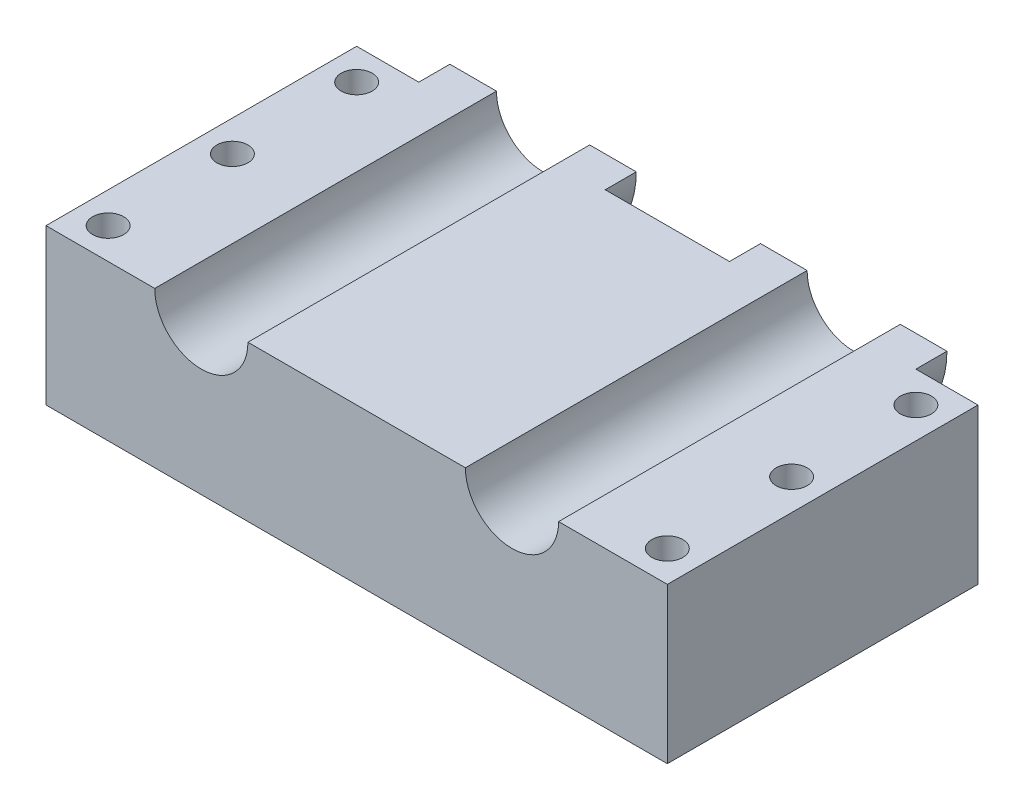
ISO-10303-21;
HEADER;
FILE_DESCRIPTION(('STEP AP214'),'2;1');
FILE_NAME('part.step','',(''),(''),'','','');
FILE_SCHEMA(('AUTOMOTIVE_DESIGN { 1 0 10303 214 1 1 1 1 }'));
ENDSEC;
DATA;
#1=APPLICATION_CONTEXT('core data for automotive mechanical design processes');
#2=APPLICATION_PROTOCOL_DEFINITION('international standard','automotive_design',2000,#1);
#3=PRODUCT_CONTEXT('',#1,'mechanical');
#4=PRODUCT('Part','Part','',(#3));
#5=PRODUCT_RELATED_PRODUCT_CATEGORY('part','',(#4));
#6=PRODUCT_DEFINITION_FORMATION('','',#4);
#7=PRODUCT_DEFINITION_CONTEXT('part definition',#1,'design');
#8=PRODUCT_DEFINITION('design','',#6,#7);
#9=PRODUCT_DEFINITION_SHAPE('','',#8);
#10=(LENGTH_UNIT() NAMED_UNIT(*) SI_UNIT(.MILLI.,.METRE.));
#11=(NAMED_UNIT(*) PLANE_ANGLE_UNIT() SI_UNIT($,.RADIAN.));
#12=(NAMED_UNIT(*) SI_UNIT($,.STERADIAN.) SOLID_ANGLE_UNIT());
#13=UNCERTAINTY_MEASURE_WITH_UNIT(LENGTH_MEASURE(1.E-05),#10,'distance_accuracy_value','');
#14=(GEOMETRIC_REPRESENTATION_CONTEXT(3) GLOBAL_UNCERTAINTY_ASSIGNED_CONTEXT((#13)) GLOBAL_UNIT_ASSIGNED_CONTEXT((#10,
#11,#12)) REPRESENTATION_CONTEXT('',''));
#15=CARTESIAN_POINT('',(0.,0.,0.));
#16=DIRECTION('',(0.,0.,1.));
#17=DIRECTION('',(1.,0.,0.));
#18=AXIS2_PLACEMENT_3D('',#15,#16,#17);
#19=CARTESIAN_POINT('',(0.,63.5,0.));
#20=DIRECTION('',(0.,-1.,0.));
#21=DIRECTION('',(0.,0.,-1.));
#22=AXIS2_PLACEMENT_3D('',#19,#20,#21);
#23=PLANE('',#22);
#24=CARTESIAN_POINT('',(12.6999999999995,63.5,63.5));
#25=DIRECTION('',(0.,1.,0.));
#26=DIRECTION('',(0.,0.,1.));
#27=AXIS2_PLACEMENT_3D('',#24,#25,#26);
#28=CIRCLE('',#27,6.35);
#29=CARTESIAN_POINT('',(12.6999999999995,63.5,69.85));
#30=VERTEX_POINT('',#29);
#31=EDGE_CURVE('E247',#30,#30,#28,.T.);
#32=ORIENTED_EDGE('',*,*,#31,.F.);
#33=EDGE_LOOP('',(#32));
#34=FACE_BOUND('',#33,.T.);
#35=CARTESIAN_POINT('',(12.699999999999,63.5,12.7));
#36=DIRECTION('',(0.,1.,0.));
#37=DIRECTION('',(0.,0.,1.));
#38=AXIS2_PLACEMENT_3D('',#35,#36,#37);
#39=CIRCLE('',#38,6.35);
#40=CARTESIAN_POINT('',(12.699999999999,63.5,19.05));
#41=VERTEX_POINT('',#40);
#42=EDGE_CURVE('E289',#41,#41,#39,.T.);
#43=ORIENTED_EDGE('',*,*,#42,.F.);
#44=EDGE_LOOP('',(#43));
#45=FACE_BOUND('',#44,.T.);
#46=CARTESIAN_POINT('',(12.7000000000001,63.5,114.3));
#47=DIRECTION('',(0.,1.,0.));
#48=DIRECTION('',(0.,0.,1.));
#49=AXIS2_PLACEMENT_3D('',#46,#47,#48);
#50=CIRCLE('',#49,6.35000000000001);
#51=CARTESIAN_POINT('',(12.7000000000001,63.5,120.65));
#52=VERTEX_POINT('',#51);
#53=EDGE_CURVE('E313',#52,#52,#50,.T.);
#54=ORIENTED_EDGE('',*,*,#53,.F.);
#55=EDGE_LOOP('',(#54));
#56=FACE_BOUND('',#55,.T.);
#57=DIRECTION('',(1.,0.,0.));
#58=VECTOR('',#57,1.);
#59=CARTESIAN_POINT('',(0.,63.5,127.));
#60=LINE('',#59,#58);
#61=CARTESIAN_POINT('',(0.,63.5,127.));
#62=VERTEX_POINT('',#61);
#63=CARTESIAN_POINT('',(44.45,63.5,127.));
#64=VERTEX_POINT('',#63);
#65=EDGE_CURVE('E234',#62,#64,#60,.T.);
#66=ORIENTED_EDGE('',*,*,#65,.T.);
#67=DIRECTION('',(0.,0.,1.));
#68=VECTOR('',#67,1.);
#69=CARTESIAN_POINT('',(44.45,63.5,-12.7));
#70=LINE('',#69,#68);
#71=CARTESIAN_POINT('',(44.45,63.5,-12.7));
#72=VERTEX_POINT('',#71);
#73=EDGE_CURVE('E147',#72,#64,#70,.T.);
#74=ORIENTED_EDGE('',*,*,#73,.F.);
#75=DIRECTION('',(1.,0.,0.));
#76=VECTOR('',#75,1.);
#77=CARTESIAN_POINT('',(0.,63.5,-12.7));
#78=LINE('',#77,#76);
#79=CARTESIAN_POINT('',(25.4,63.5,-12.7));
#80=VERTEX_POINT('',#79);
#81=EDGE_CURVE('E347',#80,#72,#78,.T.);
#82=ORIENTED_EDGE('',*,*,#81,.F.);
#83=DIRECTION('',(0.,0.,1.));
#84=VECTOR('',#83,1.);
#85=CARTESIAN_POINT('',(25.4,63.5,-12.7));
#86=LINE('',#85,#84);
#87=CARTESIAN_POINT('',(25.4,63.5,0.));
#88=VERTEX_POINT('',#87);
#89=EDGE_CURVE('E282',#80,#88,#86,.T.);
#90=ORIENTED_EDGE('',*,*,#89,.T.);
#91=DIRECTION('',(1.,0.,0.));
#92=VECTOR('',#91,1.);
#93=CARTESIAN_POINT('',(0.,63.5,0.));
#94=LINE('',#93,#92);
#95=CARTESIAN_POINT('',(0.,63.5,0.));
#96=VERTEX_POINT('',#95);
#97=EDGE_CURVE('E281',#96,#88,#94,.T.);
#98=ORIENTED_EDGE('',*,*,#97,.F.);
#99=DIRECTION('',(0.,0.,1.));
#100=VECTOR('',#99,1.);
#101=CARTESIAN_POINT('',(0.,63.5,0.));
#102=LINE('',#101,#100);
#103=EDGE_CURVE('E237',#96,#62,#102,.T.);
#104=ORIENTED_EDGE('',*,*,#103,.T.);
#105=EDGE_LOOP('',(#66,#74,#82,#90,#98,#104));
#106=FACE_BOUND('',#105,.T.);
#107=ADVANCED_FACE('F122',(#34,#45,#56,#106),#23,.F.);
#108=DIRECTION('',(0.,0.,1.));
#109=VECTOR('',#108,1.);
#110=CARTESIAN_POINT('',(82.55,63.5,-12.7));
#111=LINE('',#110,#109);
#112=CARTESIAN_POINT('',(82.55,63.5,-12.7));
#113=VERTEX_POINT('',#112);
#114=CARTESIAN_POINT('',(82.55,63.5,127.));
#115=VERTEX_POINT('',#114);
#116=EDGE_CURVE('E216',#113,#115,#111,.T.);
#117=ORIENTED_EDGE('',*,*,#116,.T.);
#118=CARTESIAN_POINT('',(171.45,63.5,127.));
#119=VERTEX_POINT('',#118);
#120=EDGE_CURVE('E219',#115,#119,#60,.T.);
#121=ORIENTED_EDGE('',*,*,#120,.T.);
#122=DIRECTION('',(0.,0.,1.));
#123=VECTOR('',#122,1.);
#124=CARTESIAN_POINT('',(171.45,63.5,-12.7));
#125=LINE('',#124,#123);
#126=CARTESIAN_POINT('',(171.45,63.5,-12.7));
#127=VERTEX_POINT('',#126);
#128=EDGE_CURVE('E139',#127,#119,#125,.T.);
#129=ORIENTED_EDGE('',*,*,#128,.F.);
#130=DIRECTION('',(1.,0.,0.));
#131=VECTOR('',#130,1.);
#132=CARTESIAN_POINT('',(0.,63.5,-12.7));
#133=LINE('',#132,#131);
#134=CARTESIAN_POINT('',(152.4,63.5,-12.7));
#135=VERTEX_POINT('',#134);
#136=EDGE_CURVE('E336',#135,#127,#133,.T.);
#137=ORIENTED_EDGE('',*,*,#136,.F.);
#138=DIRECTION('',(0.,0.,1.));
#139=VECTOR('',#138,1.);
#140=CARTESIAN_POINT('',(152.4,63.5,-12.7));
#141=LINE('',#140,#139);
#142=CARTESIAN_POINT('',(152.4,63.5,0.));
#143=VERTEX_POINT('',#142);
#144=EDGE_CURVE('E324',#135,#143,#141,.T.);
#145=ORIENTED_EDGE('',*,*,#144,.T.);
#146=CARTESIAN_POINT('',(101.6,63.5,0.));
#147=VERTEX_POINT('',#146);
#148=EDGE_CURVE('E284',#147,#143,#94,.T.);
#149=ORIENTED_EDGE('',*,*,#148,.F.);
#150=DIRECTION('',(0.,0.,1.));
#151=VECTOR('',#150,1.);
#152=CARTESIAN_POINT('',(101.6,63.5,-12.7));
#153=LINE('',#152,#151);
#154=CARTESIAN_POINT('',(101.6,63.5,-12.7));
#155=VERTEX_POINT('',#154);
#156=EDGE_CURVE('E222',#155,#147,#153,.T.);
#157=ORIENTED_EDGE('',*,*,#156,.F.);
#158=EDGE_CURVE('E221',#113,#155,#78,.T.);
#159=ORIENTED_EDGE('',*,*,#158,.F.);
#160=EDGE_LOOP('',(#117,#121,#129,#137,#145,#149,#157,#159));
#161=FACE_BOUND('',#160,.T.);
#162=ADVANCED_FACE('F217',(#161),#23,.F.);
#163=CARTESIAN_POINT('',(0.,63.5,127.));
#164=DIRECTION('',(0.,0.,-1.));
#165=DIRECTION('',(-1.,0.,0.));
#166=AXIS2_PLACEMENT_3D('',#163,#164,#165);
#167=PLANE('',#166);
#168=CARTESIAN_POINT('',(63.5,63.5,127.));
#169=DIRECTION('',(0.,0.,-1.));
#170=DIRECTION('',(-1.,0.,0.));
#171=AXIS2_PLACEMENT_3D('',#168,#169,#170);
#172=CIRCLE('',#171,19.05);
#173=EDGE_CURVE('E224',#64,#115,#172,.F.);
#174=ORIENTED_EDGE('',*,*,#173,.F.);
#175=ORIENTED_EDGE('',*,*,#65,.F.);
#176=DIRECTION('',(0.,-1.,0.));
#177=VECTOR('',#176,1.);
#178=CARTESIAN_POINT('',(0.,63.5,127.));
#179=LINE('',#178,#177);
#180=CARTESIAN_POINT('',(0.,0.,127.));
#181=VERTEX_POINT('',#180);
#182=EDGE_CURVE('E131',#62,#181,#179,.T.);
#183=ORIENTED_EDGE('',*,*,#182,.T.);
#184=DIRECTION('',(1.,0.,0.));
#185=VECTOR('',#184,1.);
#186=CARTESIAN_POINT('',(0.,0.,127.));
#187=LINE('',#186,#185);
#188=CARTESIAN_POINT('',(254.,0.,127.));
#189=VERTEX_POINT('',#188);
#190=EDGE_CURVE('E250',#181,#189,#187,.T.);
#191=ORIENTED_EDGE('',*,*,#190,.T.);
#192=DIRECTION('',(0.,-1.,0.));
#193=VECTOR('',#192,1.);
#194=CARTESIAN_POINT('',(254.,63.5,127.));
#195=LINE('',#194,#193);
#196=CARTESIAN_POINT('',(254.,63.5,127.));
#197=VERTEX_POINT('',#196);
#198=EDGE_CURVE('E257',#197,#189,#195,.T.);
#199=ORIENTED_EDGE('',*,*,#198,.F.);
#200=CARTESIAN_POINT('',(209.55,63.5,127.));
#201=VERTEX_POINT('',#200);
#202=EDGE_CURVE('E235',#201,#197,#60,.T.);
#203=ORIENTED_EDGE('',*,*,#202,.F.);
#204=CARTESIAN_POINT('',(190.5,63.5,127.));
#205=DIRECTION('',(0.,0.,-1.));
#206=DIRECTION('',(-1.,0.,0.));
#207=AXIS2_PLACEMENT_3D('',#204,#205,#206);
#208=CIRCLE('',#207,19.05);
#209=EDGE_CURVE('E230',#201,#119,#208,.T.);
#210=ORIENTED_EDGE('',*,*,#209,.T.);
#211=ORIENTED_EDGE('',*,*,#120,.F.);
#212=EDGE_LOOP('',(#174,#175,#183,#191,#199,#203,#210,#211));
#213=FACE_BOUND('',#212,.T.);
#214=ADVANCED_FACE('F232',(#213),#167,.F.);
#215=DIRECTION('',(0.,0.,1.));
#216=VECTOR('',#215,1.);
#217=CARTESIAN_POINT('',(209.55,63.5,-12.7));
#218=LINE('',#217,#216);
#219=CARTESIAN_POINT('',(209.55,63.5,-12.7));
#220=VERTEX_POINT('',#219);
#221=EDGE_CURVE('E328',#220,#201,#218,.T.);
#222=ORIENTED_EDGE('',*,*,#221,.T.);
#223=ORIENTED_EDGE('',*,*,#202,.T.);
#224=DIRECTION('',(0.,0.,1.));
#225=VECTOR('',#224,1.);
#226=CARTESIAN_POINT('',(254.,63.5,0.));
#227=LINE('',#226,#225);
#228=CARTESIAN_POINT('',(254.,63.5,0.));
#229=VERTEX_POINT('',#228);
#230=EDGE_CURVE('E238',#229,#197,#227,.T.);
#231=ORIENTED_EDGE('',*,*,#230,.F.);
#232=CARTESIAN_POINT('',(228.6,63.5,0.));
#233=VERTEX_POINT('',#232);
#234=EDGE_CURVE('E254',#233,#229,#94,.T.);
#235=ORIENTED_EDGE('',*,*,#234,.F.);
#236=DIRECTION('',(0.,0.,1.));
#237=VECTOR('',#236,1.);
#238=CARTESIAN_POINT('',(228.6,63.5,-12.7));
#239=LINE('',#238,#237);
#240=CARTESIAN_POINT('',(228.6,63.5,-12.7));
#241=VERTEX_POINT('',#240);
#242=EDGE_CURVE('E319',#241,#233,#239,.T.);
#243=ORIENTED_EDGE('',*,*,#242,.F.);
#244=EDGE_CURVE('E334',#220,#241,#133,.T.);
#245=ORIENTED_EDGE('',*,*,#244,.F.);
#246=EDGE_LOOP('',(#222,#223,#231,#235,#243,#245));
#247=FACE_BOUND('',#246,.T.);
#248=CARTESIAN_POINT('',(241.299999999999,63.5,12.7));
#249=DIRECTION('',(0.,1.,0.));
#250=DIRECTION('',(0.,0.,1.));
#251=AXIS2_PLACEMENT_3D('',#248,#249,#250);
#252=CIRCLE('',#251,6.34999999999997);
#253=CARTESIAN_POINT('',(241.299999999999,63.5,19.05));
#254=VERTEX_POINT('',#253);
#255=EDGE_CURVE('E295',#254,#254,#252,.T.);
#256=ORIENTED_EDGE('',*,*,#255,.F.);
#257=EDGE_LOOP('',(#256));
#258=FACE_BOUND('',#257,.T.);
#259=CARTESIAN_POINT('',(241.3,63.5,63.5));
#260=DIRECTION('',(0.,1.,0.));
#261=DIRECTION('',(0.,0.,1.));
#262=AXIS2_PLACEMENT_3D('',#259,#260,#261);
#263=CIRCLE('',#262,6.34999999999994);
#264=CARTESIAN_POINT('',(241.3,63.5,69.8499999999999));
#265=VERTEX_POINT('',#264);
#266=EDGE_CURVE('E301',#265,#265,#263,.T.);
#267=ORIENTED_EDGE('',*,*,#266,.F.);
#268=EDGE_LOOP('',(#267));
#269=FACE_BOUND('',#268,.T.);
#270=CARTESIAN_POINT('',(241.3,63.5,114.3));
#271=DIRECTION('',(0.,1.,0.));
#272=DIRECTION('',(0.,0.,1.));
#273=AXIS2_PLACEMENT_3D('',#270,#271,#272);
#274=CIRCLE('',#273,6.34999999999997);
#275=CARTESIAN_POINT('',(241.3,63.5,120.65));
#276=VERTEX_POINT('',#275);
#277=EDGE_CURVE('E307',#276,#276,#274,.T.);
#278=ORIENTED_EDGE('',*,*,#277,.F.);
#279=EDGE_LOOP('',(#278));
#280=FACE_BOUND('',#279,.T.);
#281=ADVANCED_FACE('F370',(#247,#258,#269,#280),#23,.F.);
#282=CARTESIAN_POINT('',(0.,0.,0.));
#283=DIRECTION('',(0.,-1.,0.));
#284=DIRECTION('',(0.,0.,-1.));
#285=AXIS2_PLACEMENT_3D('',#282,#283,#284);
#286=PLANE('',#285);
#287=CARTESIAN_POINT('',(241.3,0.,114.3));
#288=DIRECTION('',(0.,1.,0.));
#289=DIRECTION('',(0.,0.,1.));
#290=AXIS2_PLACEMENT_3D('',#287,#288,#289);
#291=CIRCLE('',#290,6.34999999999997);
#292=CARTESIAN_POINT('',(241.3,0.,120.65));
#293=VERTEX_POINT('',#292);
#294=EDGE_CURVE('E310',#293,#293,#291,.T.);
#295=ORIENTED_EDGE('',*,*,#294,.T.);
#296=EDGE_LOOP('',(#295));
#297=FACE_BOUND('',#296,.T.);
#298=CARTESIAN_POINT('',(241.299999999999,0.,12.7));
#299=DIRECTION('',(0.,1.,0.));
#300=DIRECTION('',(0.,0.,1.));
#301=AXIS2_PLACEMENT_3D('',#298,#299,#300);
#302=CIRCLE('',#301,6.34999999999997);
#303=CARTESIAN_POINT('',(241.299999999999,0.,19.05));
#304=VERTEX_POINT('',#303);
#305=EDGE_CURVE('E298',#304,#304,#302,.T.);
#306=ORIENTED_EDGE('',*,*,#305,.T.);
#307=EDGE_LOOP('',(#306));
#308=FACE_BOUND('',#307,.T.);
#309=CARTESIAN_POINT('',(12.6999999999995,0.,63.5));
#310=DIRECTION('',(0.,1.,0.));
#311=DIRECTION('',(0.,0.,1.));
#312=AXIS2_PLACEMENT_3D('',#309,#310,#311);
#313=CIRCLE('',#312,6.35);
#314=CARTESIAN_POINT('',(12.6999999999995,0.,69.85));
#315=VERTEX_POINT('',#314);
#316=EDGE_CURVE('E286',#315,#315,#313,.T.);
#317=ORIENTED_EDGE('',*,*,#316,.T.);
#318=EDGE_LOOP('',(#317));
#319=FACE_BOUND('',#318,.T.);
#320=DIRECTION('',(1.,0.,0.));
#321=VECTOR('',#320,1.);
#322=CARTESIAN_POINT('',(0.,0.,0.));
#323=LINE('',#322,#321);
#324=CARTESIAN_POINT('',(0.,0.,0.));
#325=VERTEX_POINT('',#324);
#326=CARTESIAN_POINT('',(254.,0.,0.));
#327=VERTEX_POINT('',#326);
#328=EDGE_CURVE('E243',#325,#327,#323,.T.);
#329=ORIENTED_EDGE('',*,*,#328,.T.);
#330=DIRECTION('',(0.,0.,1.));
#331=VECTOR('',#330,1.);
#332=CARTESIAN_POINT('',(254.,0.,0.));
#333=LINE('',#332,#331);
#334=EDGE_CURVE('E246',#327,#189,#333,.T.);
#335=ORIENTED_EDGE('',*,*,#334,.T.);
#336=ORIENTED_EDGE('',*,*,#190,.F.);
#337=DIRECTION('',(0.,0.,1.));
#338=VECTOR('',#337,1.);
#339=CARTESIAN_POINT('',(0.,0.,0.));
#340=LINE('',#339,#338);
#341=EDGE_CURVE('E253',#325,#181,#340,.T.);
#342=ORIENTED_EDGE('',*,*,#341,.F.);
#343=EDGE_LOOP('',(#329,#335,#336,#342));
#344=FACE_BOUND('',#343,.T.);
#345=CARTESIAN_POINT('',(12.699999999999,0.,12.7));
#346=DIRECTION('',(0.,1.,0.));
#347=DIRECTION('',(0.,0.,1.));
#348=AXIS2_PLACEMENT_3D('',#345,#346,#347);
#349=CIRCLE('',#348,6.35);
#350=CARTESIAN_POINT('',(12.699999999999,0.,19.05));
#351=VERTEX_POINT('',#350);
#352=EDGE_CURVE('E292',#351,#351,#349,.T.);
#353=ORIENTED_EDGE('',*,*,#352,.T.);
#354=EDGE_LOOP('',(#353));
#355=FACE_BOUND('',#354,.T.);
#356=CARTESIAN_POINT('',(241.3,0.,63.5));
#357=DIRECTION('',(0.,1.,0.));
#358=DIRECTION('',(0.,0.,1.));
#359=AXIS2_PLACEMENT_3D('',#356,#357,#358);
#360=CIRCLE('',#359,6.34999999999994);
#361=CARTESIAN_POINT('',(241.3,0.,69.8499999999999));
#362=VERTEX_POINT('',#361);
#363=EDGE_CURVE('E304',#362,#362,#360,.T.);
#364=ORIENTED_EDGE('',*,*,#363,.T.);
#365=EDGE_LOOP('',(#364));
#366=FACE_BOUND('',#365,.T.);
#367=CARTESIAN_POINT('',(12.7000000000001,0.,114.3));
#368=DIRECTION('',(0.,1.,0.));
#369=DIRECTION('',(0.,0.,1.));
#370=AXIS2_PLACEMENT_3D('',#367,#368,#369);
#371=CIRCLE('',#370,6.35000000000001);
#372=CARTESIAN_POINT('',(12.7000000000001,0.,120.65));
#373=VERTEX_POINT('',#372);
#374=EDGE_CURVE('E316',#373,#373,#371,.T.);
#375=ORIENTED_EDGE('',*,*,#374,.T.);
#376=EDGE_LOOP('',(#375));
#377=FACE_BOUND('',#376,.T.);
#378=ADVANCED_FACE('F271',(#297,#308,#319,#344,#355,#366,#377),#286,.T.);
#379=CARTESIAN_POINT('',(0.,63.5,0.));
#380=DIRECTION('',(0.,0.,-1.));
#381=DIRECTION('',(-1.,0.,0.));
#382=AXIS2_PLACEMENT_3D('',#379,#380,#381);
#383=PLANE('',#382);
#384=CARTESIAN_POINT('',(63.5,63.5,0.));
#385=DIRECTION('',(0.,0.,-1.));
#386=DIRECTION('',(-1.,0.,0.));
#387=AXIS2_PLACEMENT_3D('',#384,#385,#386);
#388=CIRCLE('',#387,38.1);
#389=EDGE_CURVE('E229',#88,#147,#388,.F.);
#390=ORIENTED_EDGE('',*,*,#389,.T.);
#391=ORIENTED_EDGE('',*,*,#148,.T.);
#392=CARTESIAN_POINT('',(190.5,63.5,0.));
#393=DIRECTION('',(0.,0.,-1.));
#394=DIRECTION('',(-1.,0.,0.));
#395=AXIS2_PLACEMENT_3D('',#392,#393,#394);
#396=CIRCLE('',#395,38.1);
#397=EDGE_CURVE('E331',#233,#143,#396,.T.);
#398=ORIENTED_EDGE('',*,*,#397,.F.);
#399=ORIENTED_EDGE('',*,*,#234,.T.);
#400=DIRECTION('',(0.,-1.,0.));
#401=VECTOR('',#400,1.);
#402=CARTESIAN_POINT('',(254.,63.5,0.));
#403=LINE('',#402,#401);
#404=EDGE_CURVE('E126',#229,#327,#403,.T.);
#405=ORIENTED_EDGE('',*,*,#404,.T.);
#406=ORIENTED_EDGE('',*,*,#328,.F.);
#407=DIRECTION('',(0.,-1.,0.));
#408=VECTOR('',#407,1.);
#409=CARTESIAN_POINT('',(0.,63.5,0.));
#410=LINE('',#409,#408);
#411=EDGE_CURVE('E12',#96,#325,#410,.T.);
#412=ORIENTED_EDGE('',*,*,#411,.F.);
#413=ORIENTED_EDGE('',*,*,#97,.T.);
#414=EDGE_LOOP('',(#390,#391,#398,#399,#405,#406,#412,#413));
#415=FACE_BOUND('',#414,.T.);
#416=ADVANCED_FACE('F124',(#415),#383,.T.);
#417=CARTESIAN_POINT('',(0.,63.5,0.));
#418=DIRECTION('',(1.,0.,0.));
#419=DIRECTION('',(0.,0.,-1.));
#420=AXIS2_PLACEMENT_3D('',#417,#418,#419);
#421=PLANE('',#420);
#422=ORIENTED_EDGE('',*,*,#341,.T.);
#423=ORIENTED_EDGE('',*,*,#182,.F.);
#424=ORIENTED_EDGE('',*,*,#103,.F.);
#425=ORIENTED_EDGE('',*,*,#411,.T.);
#426=EDGE_LOOP('',(#422,#423,#424,#425));
#427=FACE_BOUND('',#426,.T.);
#428=ADVANCED_FACE('F275',(#427),#421,.F.);
#429=CARTESIAN_POINT('',(254.,63.5,0.));
#430=DIRECTION('',(1.,0.,0.));
#431=DIRECTION('',(0.,0.,-1.));
#432=AXIS2_PLACEMENT_3D('',#429,#430,#431);
#433=PLANE('',#432);
#434=ORIENTED_EDGE('',*,*,#334,.F.);
#435=ORIENTED_EDGE('',*,*,#404,.F.);
#436=ORIENTED_EDGE('',*,*,#230,.T.);
#437=ORIENTED_EDGE('',*,*,#198,.T.);
#438=EDGE_LOOP('',(#434,#435,#436,#437));
#439=FACE_BOUND('',#438,.T.);
#440=ADVANCED_FACE('F267',(#439),#433,.T.);
#441=CARTESIAN_POINT('',(12.6999999999995,63.5,63.5));
#442=DIRECTION('',(0.,-1.,0.));
#443=DIRECTION('',(0.,0.,-1.));
#444=AXIS2_PLACEMENT_3D('',#441,#442,#443);
#445=CYLINDRICAL_SURFACE('',#444,6.35);
#446=ORIENTED_EDGE('',*,*,#31,.T.);
#447=EDGE_LOOP('',(#446));
#448=FACE_BOUND('',#447,.T.);
#449=ORIENTED_EDGE('',*,*,#316,.F.);
#450=EDGE_LOOP('',(#449));
#451=FACE_BOUND('',#450,.T.);
#452=ADVANCED_FACE('F403',(#448,#451),#445,.F.);
#453=CARTESIAN_POINT('',(12.699999999999,63.5,12.7));
#454=DIRECTION('',(0.,-1.,0.));
#455=DIRECTION('',(0.,0.,-1.));
#456=AXIS2_PLACEMENT_3D('',#453,#454,#455);
#457=CYLINDRICAL_SURFACE('',#456,6.35);
#458=ORIENTED_EDGE('',*,*,#42,.T.);
#459=EDGE_LOOP('',(#458));
#460=FACE_BOUND('',#459,.T.);
#461=ORIENTED_EDGE('',*,*,#352,.F.);
#462=EDGE_LOOP('',(#461));
#463=FACE_BOUND('',#462,.T.);
#464=ADVANCED_FACE('F408',(#460,#463),#457,.F.);
#465=CARTESIAN_POINT('',(241.299999999999,63.5,12.7));
#466=DIRECTION('',(0.,-1.,0.));
#467=DIRECTION('',(0.,0.,-1.));
#468=AXIS2_PLACEMENT_3D('',#465,#466,#467);
#469=CYLINDRICAL_SURFACE('',#468,6.34999999999997);
#470=ORIENTED_EDGE('',*,*,#255,.T.);
#471=EDGE_LOOP('',(#470));
#472=FACE_BOUND('',#471,.T.);
#473=ORIENTED_EDGE('',*,*,#305,.F.);
#474=EDGE_LOOP('',(#473));
#475=FACE_BOUND('',#474,.T.);
#476=ADVANCED_FACE('F445',(#472,#475),#469,.F.);
#477=CARTESIAN_POINT('',(241.3,63.5,63.5));
#478=DIRECTION('',(0.,-1.,0.));
#479=DIRECTION('',(0.,0.,-1.));
#480=AXIS2_PLACEMENT_3D('',#477,#478,#479);
#481=CYLINDRICAL_SURFACE('',#480,6.34999999999994);
#482=ORIENTED_EDGE('',*,*,#266,.T.);
#483=EDGE_LOOP('',(#482));
#484=FACE_BOUND('',#483,.T.);
#485=ORIENTED_EDGE('',*,*,#363,.F.);
#486=EDGE_LOOP('',(#485));
#487=FACE_BOUND('',#486,.T.);
#488=ADVANCED_FACE('F455',(#484,#487),#481,.F.);
#489=CARTESIAN_POINT('',(241.3,63.5,114.3));
#490=DIRECTION('',(0.,-1.,0.));
#491=DIRECTION('',(0.,0.,-1.));
#492=AXIS2_PLACEMENT_3D('',#489,#490,#491);
#493=CYLINDRICAL_SURFACE('',#492,6.34999999999997);
#494=ORIENTED_EDGE('',*,*,#277,.T.);
#495=EDGE_LOOP('',(#494));
#496=FACE_BOUND('',#495,.T.);
#497=ORIENTED_EDGE('',*,*,#294,.F.);
#498=EDGE_LOOP('',(#497));
#499=FACE_BOUND('',#498,.T.);
#500=ADVANCED_FACE('F465',(#496,#499),#493,.F.);
#501=CARTESIAN_POINT('',(12.7000000000001,63.5,114.3));
#502=DIRECTION('',(0.,-1.,0.));
#503=DIRECTION('',(0.,0.,-1.));
#504=AXIS2_PLACEMENT_3D('',#501,#502,#503);
#505=CYLINDRICAL_SURFACE('',#504,6.35000000000001);
#506=ORIENTED_EDGE('',*,*,#53,.T.);
#507=EDGE_LOOP('',(#506));
#508=FACE_BOUND('',#507,.T.);
#509=ORIENTED_EDGE('',*,*,#374,.F.);
#510=EDGE_LOOP('',(#509));
#511=FACE_BOUND('',#510,.T.);
#512=ADVANCED_FACE('F380',(#508,#511),#505,.F.);
#513=CARTESIAN_POINT('',(190.5,63.5,-12.7));
#514=DIRECTION('',(0.,0.,1.));
#515=DIRECTION('',(1.,0.,0.));
#516=AXIS2_PLACEMENT_3D('',#513,#514,#515);
#517=CYLINDRICAL_SURFACE('',#516,38.1);
#518=ORIENTED_EDGE('',*,*,#397,.T.);
#519=ORIENTED_EDGE('',*,*,#144,.F.);
#520=CARTESIAN_POINT('',(190.5,63.5,-12.7));
#521=DIRECTION('',(0.,0.,-1.));
#522=DIRECTION('',(-1.,0.,0.));
#523=AXIS2_PLACEMENT_3D('',#520,#521,#522);
#524=CIRCLE('',#523,38.1);
#525=EDGE_CURVE('E337',#241,#135,#524,.T.);
#526=ORIENTED_EDGE('',*,*,#525,.F.);
#527=ORIENTED_EDGE('',*,*,#242,.T.);
#528=EDGE_LOOP('',(#518,#519,#526,#527));
#529=FACE_BOUND('',#528,.T.);
#530=ADVANCED_FACE('F362',(#529),#517,.T.);
#531=CARTESIAN_POINT('',(190.5,63.5,-12.7));
#532=DIRECTION('',(0.,0.,1.));
#533=DIRECTION('',(1.,0.,0.));
#534=AXIS2_PLACEMENT_3D('',#531,#532,#533);
#535=CYLINDRICAL_SURFACE('',#534,19.05);
#536=ORIENTED_EDGE('',*,*,#128,.T.);
#537=ORIENTED_EDGE('',*,*,#209,.F.);
#538=ORIENTED_EDGE('',*,*,#221,.F.);
#539=CARTESIAN_POINT('',(190.5,63.5,-12.7));
#540=DIRECTION('',(0.,0.,-1.));
#541=DIRECTION('',(-1.,0.,0.));
#542=AXIS2_PLACEMENT_3D('',#539,#540,#541);
#543=CIRCLE('',#542,19.05);
#544=EDGE_CURVE('E330',#220,#127,#543,.T.);
#545=ORIENTED_EDGE('',*,*,#544,.T.);
#546=EDGE_LOOP('',(#536,#537,#538,#545));
#547=FACE_BOUND('',#546,.T.);
#548=ADVANCED_FACE('F372',(#547),#535,.F.);
#549=CARTESIAN_POINT('',(0.,0.,-12.7));
#550=DIRECTION('',(0.,0.,-1.));
#551=DIRECTION('',(-1.,0.,0.));
#552=AXIS2_PLACEMENT_3D('',#549,#550,#551);
#553=PLANE('',#552);
#554=ORIENTED_EDGE('',*,*,#244,.T.);
#555=ORIENTED_EDGE('',*,*,#525,.T.);
#556=ORIENTED_EDGE('',*,*,#136,.T.);
#557=ORIENTED_EDGE('',*,*,#544,.F.);
#558=EDGE_LOOP('',(#554,#555,#556,#557));
#559=FACE_BOUND('',#558,.T.);
#560=ADVANCED_FACE('F367',(#559),#553,.T.);
#561=CARTESIAN_POINT('',(63.5,63.5,-12.7));
#562=DIRECTION('',(0.,0.,1.));
#563=DIRECTION('',(1.,0.,0.));
#564=AXIS2_PLACEMENT_3D('',#561,#562,#563);
#565=CYLINDRICAL_SURFACE('',#564,19.05);
#566=ORIENTED_EDGE('',*,*,#73,.T.);
#567=ORIENTED_EDGE('',*,*,#173,.T.);
#568=ORIENTED_EDGE('',*,*,#116,.F.);
#569=CARTESIAN_POINT('',(63.5,63.5,-12.7));
#570=DIRECTION('',(0.,0.,-1.));
#571=DIRECTION('',(-1.,0.,0.));
#572=AXIS2_PLACEMENT_3D('',#569,#570,#571);
#573=CIRCLE('',#572,19.05);
#574=EDGE_CURVE('E350',#72,#113,#573,.F.);
#575=ORIENTED_EDGE('',*,*,#574,.F.);
#576=EDGE_LOOP('',(#566,#567,#568,#575));
#577=FACE_BOUND('',#576,.T.);
#578=ADVANCED_FACE('F225',(#577),#565,.F.);
#579=CARTESIAN_POINT('',(63.5,63.5,-12.7));
#580=DIRECTION('',(0.,0.,1.));
#581=DIRECTION('',(1.,0.,0.));
#582=AXIS2_PLACEMENT_3D('',#579,#580,#581);
#583=CYLINDRICAL_SURFACE('',#582,38.1);
#584=ORIENTED_EDGE('',*,*,#389,.F.);
#585=ORIENTED_EDGE('',*,*,#89,.F.);
#586=CARTESIAN_POINT('',(63.5,63.5,-12.7));
#587=DIRECTION('',(0.,0.,-1.));
#588=DIRECTION('',(-1.,0.,0.));
#589=AXIS2_PLACEMENT_3D('',#586,#587,#588);
#590=CIRCLE('',#589,38.1);
#591=EDGE_CURVE('E345',#80,#155,#590,.F.);
#592=ORIENTED_EDGE('',*,*,#591,.T.);
#593=ORIENTED_EDGE('',*,*,#156,.T.);
#594=EDGE_LOOP('',(#584,#585,#592,#593));
#595=FACE_BOUND('',#594,.T.);
#596=ADVANCED_FACE('F359',(#595),#583,.T.);
#597=CARTESIAN_POINT('',(0.,0.,-12.7));
#598=DIRECTION('',(0.,0.,-1.));
#599=DIRECTION('',(-1.,0.,0.));
#600=AXIS2_PLACEMENT_3D('',#597,#598,#599);
#601=PLANE('',#600);
#602=ORIENTED_EDGE('',*,*,#81,.T.);
#603=ORIENTED_EDGE('',*,*,#574,.T.);
#604=ORIENTED_EDGE('',*,*,#158,.T.);
#605=ORIENTED_EDGE('',*,*,#591,.F.);
#606=EDGE_LOOP('',(#602,#603,#604,#605));
#607=FACE_BOUND('',#606,.T.);
#608=ADVANCED_FACE('F356',(#607),#601,.T.);
#609=CLOSED_SHELL('',(#107,#162,#214,#281,#378,#416,#428,#440,#452,#464,#476,#488,#500,#512,
#530,#548,#560,#578,#596,#608));
#610=MANIFOLD_SOLID_BREP('B2',#609);
#611=ADVANCED_BREP_SHAPE_REPRESENTATION('',(#18,#610),#14);
#612=SHAPE_DEFINITION_REPRESENTATION(#9,#611);
ENDSEC;
END-ISO-10303-21;
